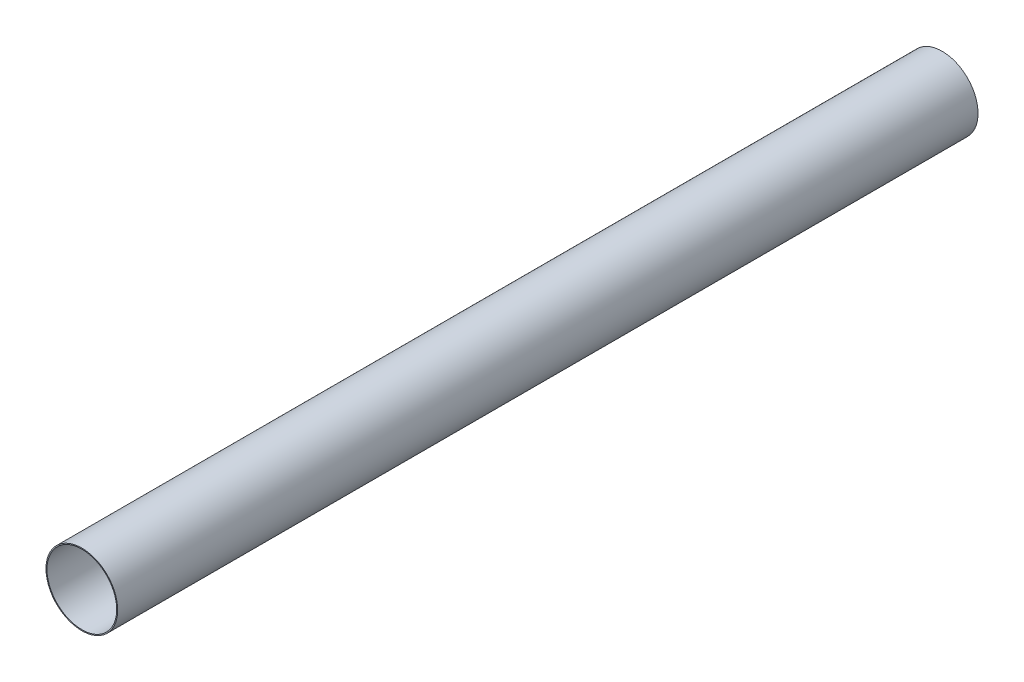
ISO-10303-21;
HEADER;
FILE_DESCRIPTION(('STEP AP214'),'2;1');
FILE_NAME('part.step','',(''),(''),'','','');
FILE_SCHEMA(('AUTOMOTIVE_DESIGN { 1 0 10303 214 1 1 1 1 }'));
ENDSEC;
DATA;
#1=APPLICATION_CONTEXT('core data for automotive mechanical design processes');
#2=APPLICATION_PROTOCOL_DEFINITION('international standard','automotive_design',2000,#1);
#3=PRODUCT_CONTEXT('',#1,'mechanical');
#4=PRODUCT('Part','Part','',(#3));
#5=PRODUCT_RELATED_PRODUCT_CATEGORY('part','',(#4));
#6=PRODUCT_DEFINITION_FORMATION('','',#4);
#7=PRODUCT_DEFINITION_CONTEXT('part definition',#1,'design');
#8=PRODUCT_DEFINITION('design','',#6,#7);
#9=PRODUCT_DEFINITION_SHAPE('','',#8);
#10=(LENGTH_UNIT() NAMED_UNIT(*) SI_UNIT(.MILLI.,.METRE.));
#11=(NAMED_UNIT(*) PLANE_ANGLE_UNIT() SI_UNIT($,.RADIAN.));
#12=(NAMED_UNIT(*) SI_UNIT($,.STERADIAN.) SOLID_ANGLE_UNIT());
#13=UNCERTAINTY_MEASURE_WITH_UNIT(LENGTH_MEASURE(1.E-05),#10,'distance_accuracy_value','');
#14=(GEOMETRIC_REPRESENTATION_CONTEXT(3) GLOBAL_UNCERTAINTY_ASSIGNED_CONTEXT((#13)) GLOBAL_UNIT_ASSIGNED_CONTEXT((#10,
#11,#12)) REPRESENTATION_CONTEXT('',''));
#15=CARTESIAN_POINT('',(0.,0.,0.));
#16=DIRECTION('',(0.,0.,1.));
#17=DIRECTION('',(1.,0.,0.));
#18=AXIS2_PLACEMENT_3D('',#15,#16,#17);
#19=CARTESIAN_POINT('',(0.,0.,1219.2));
#20=DIRECTION('',(0.,0.,1.));
#21=DIRECTION('',(1.,0.,0.));
#22=AXIS2_PLACEMENT_3D('',#19,#20,#21);
#23=PLANE('',#22);
#24=CARTESIAN_POINT('',(0.,0.,1219.2));
#25=DIRECTION('',(0.,0.,1.));
#26=DIRECTION('',(1.,0.,0.));
#27=AXIS2_PLACEMENT_3D('',#24,#25,#26);
#28=CIRCLE('',#27,50.8);
#29=CARTESIAN_POINT('',(-50.8,0.,1219.2));
#30=VERTEX_POINT('',#29);
#31=EDGE_CURVE('E10',#30,#30,#28,.T.);
#32=ORIENTED_EDGE('',*,*,#31,.T.);
#33=EDGE_LOOP('',(#32));
#34=FACE_BOUND('',#33,.T.);
#35=CARTESIAN_POINT('',(0.,0.,1219.2));
#36=DIRECTION('',(0.,0.,1.));
#37=DIRECTION('',(1.,0.,0.));
#38=AXIS2_PLACEMENT_3D('',#35,#36,#37);
#39=CIRCLE('',#38,49.403);
#40=CARTESIAN_POINT('',(-49.403,0.,1219.2));
#41=VERTEX_POINT('',#40);
#42=EDGE_CURVE('E48',#41,#41,#39,.T.);
#43=ORIENTED_EDGE('',*,*,#42,.F.);
#44=EDGE_LOOP('',(#43));
#45=FACE_BOUND('',#44,.T.);
#46=ADVANCED_FACE('F37',(#34,#45),#23,.T.);
#47=CARTESIAN_POINT('',(0.,0.,0.));
#48=DIRECTION('',(0.,0.,1.));
#49=DIRECTION('',(1.,0.,0.));
#50=AXIS2_PLACEMENT_3D('',#47,#48,#49);
#51=PLANE('',#50);
#52=CARTESIAN_POINT('',(0.,0.,0.));
#53=DIRECTION('',(0.,0.,1.));
#54=DIRECTION('',(1.,0.,0.));
#55=AXIS2_PLACEMENT_3D('',#52,#53,#54);
#56=CIRCLE('',#55,50.8);
#57=CARTESIAN_POINT('',(-50.8,0.,0.));
#58=VERTEX_POINT('',#57);
#59=EDGE_CURVE('E41',#58,#58,#56,.T.);
#60=ORIENTED_EDGE('',*,*,#59,.F.);
#61=EDGE_LOOP('',(#60));
#62=FACE_BOUND('',#61,.T.);
#63=CARTESIAN_POINT('',(0.,0.,0.));
#64=DIRECTION('',(0.,0.,1.));
#65=DIRECTION('',(1.,0.,0.));
#66=AXIS2_PLACEMENT_3D('',#63,#64,#65);
#67=CIRCLE('',#66,49.403);
#68=CARTESIAN_POINT('',(-49.403,0.,0.));
#69=VERTEX_POINT('',#68);
#70=EDGE_CURVE('E50',#69,#69,#67,.T.);
#71=ORIENTED_EDGE('',*,*,#70,.T.);
#72=EDGE_LOOP('',(#71));
#73=FACE_BOUND('',#72,.T.);
#74=ADVANCED_FACE('F60',(#62,#73),#51,.F.);
#75=CARTESIAN_POINT('',(0.,0.,1219.2));
#76=DIRECTION('',(0.,0.,-1.));
#77=DIRECTION('',(-1.,0.,0.));
#78=AXIS2_PLACEMENT_3D('',#75,#76,#77);
#79=CYLINDRICAL_SURFACE('',#78,50.8);
#80=CARTESIAN_POINT('',(-50.8,0.,1219.2));
#81=CARTESIAN_POINT('',(-50.8,0.,1206.5));
#82=CARTESIAN_POINT('',(-50.8,0.,1193.8));
#83=CARTESIAN_POINT('',(-50.8,0.,1168.4));
#84=CARTESIAN_POINT('',(-50.8,0.,1155.7));
#85=CARTESIAN_POINT('',(-50.8,0.,1130.3));
#86=CARTESIAN_POINT('',(-50.8,0.,1117.6));
#87=CARTESIAN_POINT('',(-50.8,0.,1092.2));
#88=CARTESIAN_POINT('',(-50.8,0.,1079.5));
#89=CARTESIAN_POINT('',(-50.8,0.,1054.1));
#90=CARTESIAN_POINT('',(-50.8,0.,1041.4));
#91=CARTESIAN_POINT('',(-50.8,0.,1016.));
#92=CARTESIAN_POINT('',(-50.8,0.,1003.3));
#93=CARTESIAN_POINT('',(-50.8,0.,977.9));
#94=CARTESIAN_POINT('',(-50.8,0.,965.2));
#95=CARTESIAN_POINT('',(-50.8,0.,939.8));
#96=CARTESIAN_POINT('',(-50.8,0.,927.1));
#97=CARTESIAN_POINT('',(-50.8,0.,901.7));
#98=CARTESIAN_POINT('',(-50.8,0.,889.));
#99=CARTESIAN_POINT('',(-50.8,0.,863.6));
#100=CARTESIAN_POINT('',(-50.8,0.,850.9));
#101=CARTESIAN_POINT('',(-50.8,0.,825.5));
#102=CARTESIAN_POINT('',(-50.8,0.,812.8));
#103=CARTESIAN_POINT('',(-50.8,0.,787.4));
#104=CARTESIAN_POINT('',(-50.8,0.,774.7));
#105=CARTESIAN_POINT('',(-50.8,0.,749.3));
#106=CARTESIAN_POINT('',(-50.8,0.,736.6));
#107=CARTESIAN_POINT('',(-50.8,0.,711.2));
#108=CARTESIAN_POINT('',(-50.8,0.,698.5));
#109=CARTESIAN_POINT('',(-50.8,0.,673.1));
#110=CARTESIAN_POINT('',(-50.8,0.,660.4));
#111=CARTESIAN_POINT('',(-50.8,0.,635.));
#112=CARTESIAN_POINT('',(-50.8,0.,622.3));
#113=CARTESIAN_POINT('',(-50.8,0.,596.9));
#114=CARTESIAN_POINT('',(-50.8,0.,584.2));
#115=CARTESIAN_POINT('',(-50.8,0.,558.8));
#116=CARTESIAN_POINT('',(-50.8,0.,546.1));
#117=CARTESIAN_POINT('',(-50.8,0.,520.7));
#118=CARTESIAN_POINT('',(-50.8,0.,508.));
#119=CARTESIAN_POINT('',(-50.8,0.,482.6));
#120=CARTESIAN_POINT('',(-50.8,0.,469.9));
#121=CARTESIAN_POINT('',(-50.8,0.,444.5));
#122=CARTESIAN_POINT('',(-50.8,0.,431.8));
#123=CARTESIAN_POINT('',(-50.8,0.,406.4));
#124=CARTESIAN_POINT('',(-50.8,0.,393.7));
#125=CARTESIAN_POINT('',(-50.8,0.,368.3));
#126=CARTESIAN_POINT('',(-50.8,0.,355.6));
#127=CARTESIAN_POINT('',(-50.8,0.,330.2));
#128=CARTESIAN_POINT('',(-50.8,0.,317.5));
#129=CARTESIAN_POINT('',(-50.8,0.,292.1));
#130=CARTESIAN_POINT('',(-50.8,0.,279.4));
#131=CARTESIAN_POINT('',(-50.8,0.,254.));
#132=CARTESIAN_POINT('',(-50.8,0.,241.3));
#133=CARTESIAN_POINT('',(-50.8,0.,215.9));
#134=CARTESIAN_POINT('',(-50.8,0.,203.2));
#135=CARTESIAN_POINT('',(-50.8,0.,177.8));
#136=CARTESIAN_POINT('',(-50.8,0.,165.1));
#137=CARTESIAN_POINT('',(-50.8,0.,139.7));
#138=CARTESIAN_POINT('',(-50.8,0.,127.));
#139=CARTESIAN_POINT('',(-50.8,0.,101.6));
#140=CARTESIAN_POINT('',(-50.8,0.,88.9));
#141=CARTESIAN_POINT('',(-50.8,0.,63.5));
#142=CARTESIAN_POINT('',(-50.8,0.,50.8));
#143=CARTESIAN_POINT('',(-50.8,0.,25.4));
#144=CARTESIAN_POINT('',(-50.8,0.,12.7));
#145=CARTESIAN_POINT('',(-50.8,0.,0.));
#146=B_SPLINE_CURVE_WITH_KNOTS('',3,(#80,#81,#82,#83,#84,#85,#86,#87,#88,#89,#90,#91,#92,#93,
#94,#95,#96,#97,#98,#99,#100,#101,#102,#103,#104,#105,#106,#107,#108,#109,#110,#111,#112,#113,
#114,#115,#116,#117,#118,#119,#120,#121,#122,#123,#124,#125,#126,#127,#128,#129,#130,#131,#132,
#133,#134,#135,#136,#137,#138,#139,#140,#141,#142,#143,#144,#145),.UNSPECIFIED.,.F.,.F.,(4,2,2,
2,2,2,2,2,2,2,2,2,2,2,2,2,2,2,2,2,2,2,2,2,2,2,2,2,2,2,2,2,4),(0.,38.1,76.2,114.3,152.4,190.5,
228.6,266.7,304.8,342.9,381.,419.1,457.2,495.3,533.4,571.5,609.6,647.7,685.8,723.9,762.,800.1,
838.2,876.3,914.4,952.5,990.6,1028.7,1066.8,1104.9,1143.,1181.1,1219.2),.UNSPECIFIED.);
#147=EDGE_CURVE('BSEAM39',#30,#58,#146,.T.);
#148=ORIENTED_EDGE('',*,*,#31,.F.);
#149=ORIENTED_EDGE('',*,*,#59,.T.);
#150=ORIENTED_EDGE('',*,*,#147,.T.);
#151=ORIENTED_EDGE('',*,*,#147,.F.);
#152=EDGE_LOOP('',(#148,#150,#149,#151));
#153=FACE_BOUND('',#152,.T.);
#154=ADVANCED_FACE('F39',(#153),#79,.T.);
#155=CARTESIAN_POINT('',(0.,0.,1219.2));
#156=DIRECTION('',(0.,0.,-1.));
#157=DIRECTION('',(-1.,0.,0.));
#158=AXIS2_PLACEMENT_3D('',#155,#156,#157);
#159=CYLINDRICAL_SURFACE('',#158,49.403);
#160=CARTESIAN_POINT('',(-49.403,0.,1219.2));
#161=CARTESIAN_POINT('',(-49.403,0.,1206.5));
#162=CARTESIAN_POINT('',(-49.403,0.,1193.8));
#163=CARTESIAN_POINT('',(-49.403,0.,1168.4));
#164=CARTESIAN_POINT('',(-49.403,0.,1155.7));
#165=CARTESIAN_POINT('',(-49.403,0.,1130.3));
#166=CARTESIAN_POINT('',(-49.403,0.,1117.6));
#167=CARTESIAN_POINT('',(-49.403,0.,1092.2));
#168=CARTESIAN_POINT('',(-49.403,0.,1079.5));
#169=CARTESIAN_POINT('',(-49.403,0.,1054.1));
#170=CARTESIAN_POINT('',(-49.403,0.,1041.4));
#171=CARTESIAN_POINT('',(-49.403,0.,1016.));
#172=CARTESIAN_POINT('',(-49.403,0.,1003.3));
#173=CARTESIAN_POINT('',(-49.403,0.,977.9));
#174=CARTESIAN_POINT('',(-49.403,0.,965.2));
#175=CARTESIAN_POINT('',(-49.403,0.,939.8));
#176=CARTESIAN_POINT('',(-49.403,0.,927.1));
#177=CARTESIAN_POINT('',(-49.403,0.,901.7));
#178=CARTESIAN_POINT('',(-49.403,0.,889.));
#179=CARTESIAN_POINT('',(-49.403,0.,863.6));
#180=CARTESIAN_POINT('',(-49.403,0.,850.9));
#181=CARTESIAN_POINT('',(-49.403,0.,825.5));
#182=CARTESIAN_POINT('',(-49.403,0.,812.8));
#183=CARTESIAN_POINT('',(-49.403,0.,787.4));
#184=CARTESIAN_POINT('',(-49.403,0.,774.7));
#185=CARTESIAN_POINT('',(-49.403,0.,749.3));
#186=CARTESIAN_POINT('',(-49.403,0.,736.6));
#187=CARTESIAN_POINT('',(-49.403,0.,711.2));
#188=CARTESIAN_POINT('',(-49.403,0.,698.5));
#189=CARTESIAN_POINT('',(-49.403,0.,673.1));
#190=CARTESIAN_POINT('',(-49.403,0.,660.4));
#191=CARTESIAN_POINT('',(-49.403,0.,635.));
#192=CARTESIAN_POINT('',(-49.403,0.,622.3));
#193=CARTESIAN_POINT('',(-49.403,0.,596.9));
#194=CARTESIAN_POINT('',(-49.403,0.,584.2));
#195=CARTESIAN_POINT('',(-49.403,0.,558.8));
#196=CARTESIAN_POINT('',(-49.403,0.,546.1));
#197=CARTESIAN_POINT('',(-49.403,0.,520.7));
#198=CARTESIAN_POINT('',(-49.403,0.,508.));
#199=CARTESIAN_POINT('',(-49.403,0.,482.6));
#200=CARTESIAN_POINT('',(-49.403,0.,469.9));
#201=CARTESIAN_POINT('',(-49.403,0.,444.5));
#202=CARTESIAN_POINT('',(-49.403,0.,431.8));
#203=CARTESIAN_POINT('',(-49.403,0.,406.4));
#204=CARTESIAN_POINT('',(-49.403,0.,393.7));
#205=CARTESIAN_POINT('',(-49.403,0.,368.3));
#206=CARTESIAN_POINT('',(-49.403,0.,355.6));
#207=CARTESIAN_POINT('',(-49.403,0.,330.2));
#208=CARTESIAN_POINT('',(-49.403,0.,317.5));
#209=CARTESIAN_POINT('',(-49.403,0.,292.1));
#210=CARTESIAN_POINT('',(-49.403,0.,279.4));
#211=CARTESIAN_POINT('',(-49.403,0.,254.));
#212=CARTESIAN_POINT('',(-49.403,0.,241.3));
#213=CARTESIAN_POINT('',(-49.403,0.,215.9));
#214=CARTESIAN_POINT('',(-49.403,0.,203.2));
#215=CARTESIAN_POINT('',(-49.403,0.,177.8));
#216=CARTESIAN_POINT('',(-49.403,0.,165.1));
#217=CARTESIAN_POINT('',(-49.403,0.,139.7));
#218=CARTESIAN_POINT('',(-49.403,0.,127.));
#219=CARTESIAN_POINT('',(-49.403,0.,101.6));
#220=CARTESIAN_POINT('',(-49.403,0.,88.9));
#221=CARTESIAN_POINT('',(-49.403,0.,63.5));
#222=CARTESIAN_POINT('',(-49.403,0.,50.8));
#223=CARTESIAN_POINT('',(-49.403,0.,25.4));
#224=CARTESIAN_POINT('',(-49.403,0.,12.7));
#225=CARTESIAN_POINT('',(-49.403,0.,0.));
#226=B_SPLINE_CURVE_WITH_KNOTS('',3,(#160,#161,#162,#163,#164,#165,#166,#167,#168,#169,#170,
#171,#172,#173,#174,#175,#176,#177,#178,#179,#180,#181,#182,#183,#184,#185,#186,#187,#188,#189,
#190,#191,#192,#193,#194,#195,#196,#197,#198,#199,#200,#201,#202,#203,#204,#205,#206,#207,#208,
#209,#210,#211,#212,#213,#214,#215,#216,#217,#218,#219,#220,#221,#222,#223,#224,#225),
.UNSPECIFIED.,.F.,.F.,(4,2,2,2,2,2,2,2,2,2,2,2,2,2,2,2,2,2,2,2,2,2,2,2,2,2,2,2,2,2,2,2,4),(0.,
38.0999999999998,76.1999999999998,114.3,152.4,190.5,228.6,266.7,304.8,342.9,381.,419.1,457.2,
495.3,533.4,571.5,609.6,647.7,685.8,723.9,762.,800.1,838.2,876.3,914.4,952.5,990.6,1028.7,
1066.8,1104.9,1143.,1181.1,1219.2),.UNSPECIFIED.);
#227=EDGE_CURVE('BSEAM56',#41,#69,#226,.T.);
#228=ORIENTED_EDGE('',*,*,#42,.T.);
#229=ORIENTED_EDGE('',*,*,#70,.F.);
#230=ORIENTED_EDGE('',*,*,#227,.T.);
#231=ORIENTED_EDGE('',*,*,#227,.F.);
#232=EDGE_LOOP('',(#228,#230,#229,#231));
#233=FACE_BOUND('',#232,.T.);
#234=ADVANCED_FACE('F56',(#233),#159,.F.);
#235=CLOSED_SHELL('',(#46,#74,#154,#234));
#236=MANIFOLD_SOLID_BREP('B2',#235);
#237=ADVANCED_BREP_SHAPE_REPRESENTATION('',(#18,#236),#14);
#238=SHAPE_DEFINITION_REPRESENTATION(#9,#237);
ENDSEC;
END-ISO-10303-21;
